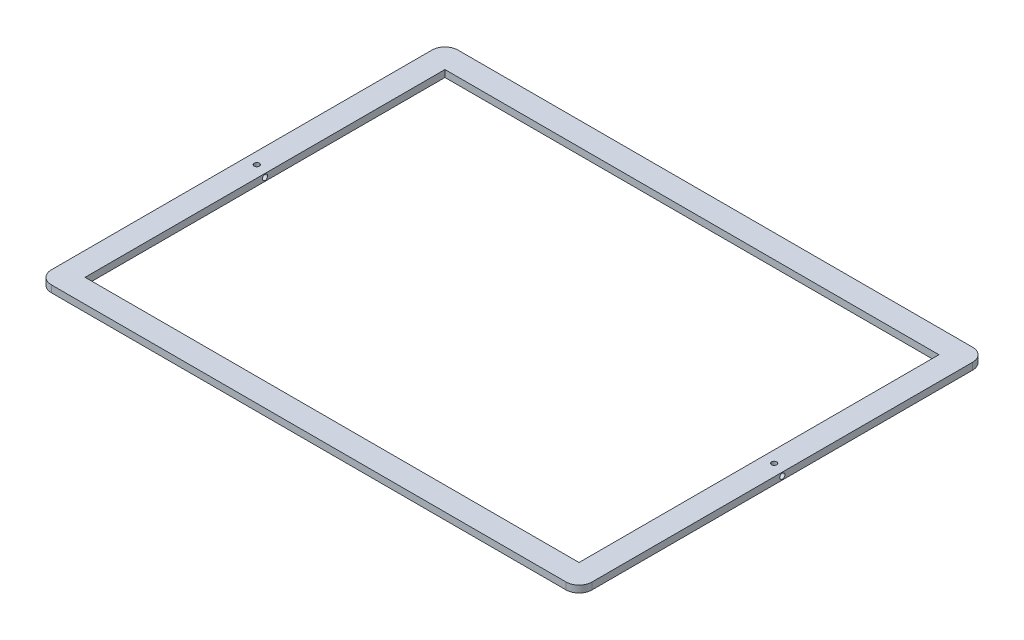
ISO-10303-21;
HEADER;
FILE_DESCRIPTION(('STEP AP214'),'2;1');
FILE_NAME('part.step','',(''),(''),'','','');
FILE_SCHEMA(('AUTOMOTIVE_DESIGN { 1 0 10303 214 1 1 1 1 }'));
ENDSEC;
DATA;
#1=APPLICATION_CONTEXT('core data for automotive mechanical design processes');
#2=APPLICATION_PROTOCOL_DEFINITION('international standard','automotive_design',2000,#1);
#3=PRODUCT_CONTEXT('',#1,'mechanical');
#4=PRODUCT('Part','Part','',(#3));
#5=PRODUCT_RELATED_PRODUCT_CATEGORY('part','',(#4));
#6=PRODUCT_DEFINITION_FORMATION('','',#4);
#7=PRODUCT_DEFINITION_CONTEXT('part definition',#1,'design');
#8=PRODUCT_DEFINITION('design','',#6,#7);
#9=PRODUCT_DEFINITION_SHAPE('','',#8);
#10=(LENGTH_UNIT() NAMED_UNIT(*) SI_UNIT(.MILLI.,.METRE.));
#11=(NAMED_UNIT(*) PLANE_ANGLE_UNIT() SI_UNIT($,.RADIAN.));
#12=(NAMED_UNIT(*) SI_UNIT($,.STERADIAN.) SOLID_ANGLE_UNIT());
#13=UNCERTAINTY_MEASURE_WITH_UNIT(LENGTH_MEASURE(1.E-05),#10,'distance_accuracy_value','');
#14=(GEOMETRIC_REPRESENTATION_CONTEXT(3) GLOBAL_UNCERTAINTY_ASSIGNED_CONTEXT((#13)) GLOBAL_UNIT_ASSIGNED_CONTEXT((#10,
#11,#12)) REPRESENTATION_CONTEXT('',''));
#15=CARTESIAN_POINT('',(0.,0.,0.));
#16=DIRECTION('',(0.,0.,1.));
#17=DIRECTION('',(1.,0.,0.));
#18=AXIS2_PLACEMENT_3D('',#15,#16,#17);
#19=CARTESIAN_POINT('',(0.,4.,0.));
#20=DIRECTION('',(0.,1.,0.));
#21=DIRECTION('',(0.,0.,1.));
#22=AXIS2_PLACEMENT_3D('',#19,#20,#21);
#23=PLANE('',#22);
#24=CARTESIAN_POINT('',(-299.,4.,-4.));
#25=DIRECTION('',(0.,1.,0.));
#26=DIRECTION('',(0.,0.,1.));
#27=AXIS2_PLACEMENT_3D('',#24,#25,#26);
#28=CIRCLE('',#27,2.99999999999999);
#29=CARTESIAN_POINT('',(-299.,4.,-1.00000000000001));
#30=VERTEX_POINT('',#29);
#31=EDGE_CURVE('E459',#30,#30,#28,.T.);
#32=ORIENTED_EDGE('',*,*,#31,.F.);
#33=EDGE_LOOP('',(#32));
#34=FACE_BOUND('',#33,.T.);
#35=CARTESIAN_POINT('',(299.,4.,-4.));
#36=DIRECTION('',(0.,1.,0.));
#37=DIRECTION('',(0.,0.,1.));
#38=AXIS2_PLACEMENT_3D('',#35,#36,#37);
#39=CIRCLE('',#38,2.99999999999999);
#40=CARTESIAN_POINT('',(299.,4.,-1.00000000000001));
#41=VERTEX_POINT('',#40);
#42=EDGE_CURVE('E343',#41,#41,#39,.T.);
#43=ORIENTED_EDGE('',*,*,#42,.F.);
#44=EDGE_LOOP('',(#43));
#45=FACE_BOUND('',#44,.T.);
#46=DIRECTION('',(1.,0.,0.));
#47=VECTOR('',#46,1.);
#48=CARTESIAN_POINT('',(-312.5,4.,235.));
#49=LINE('',#48,#47);
#50=CARTESIAN_POINT('',(-297.5,4.,235.));
#51=VERTEX_POINT('',#50);
#52=CARTESIAN_POINT('',(297.5,4.,235.));
#53=VERTEX_POINT('',#52);
#54=EDGE_CURVE('E179',#51,#53,#49,.T.);
#55=ORIENTED_EDGE('',*,*,#54,.T.);
#56=CARTESIAN_POINT('',(297.5,4.,220.));
#57=DIRECTION('',(0.,1.,0.));
#58=DIRECTION('',(0.,0.,1.));
#59=AXIS2_PLACEMENT_3D('',#56,#57,#58);
#60=CIRCLE('',#59,15.);
#61=CARTESIAN_POINT('',(312.5,4.,220.));
#62=VERTEX_POINT('',#61);
#63=EDGE_CURVE('E219',#53,#62,#60,.T.);
#64=ORIENTED_EDGE('',*,*,#63,.T.);
#65=DIRECTION('',(0.,0.,-1.));
#66=VECTOR('',#65,1.);
#67=CARTESIAN_POINT('',(312.5,4.,-235.));
#68=LINE('',#67,#66);
#69=CARTESIAN_POINT('',(312.5,4.,-220.));
#70=VERTEX_POINT('',#69);
#71=EDGE_CURVE('E183',#62,#70,#68,.T.);
#72=ORIENTED_EDGE('',*,*,#71,.T.);
#73=CARTESIAN_POINT('',(297.5,4.,-220.));
#74=DIRECTION('',(0.,1.,0.));
#75=DIRECTION('',(0.,0.,1.));
#76=AXIS2_PLACEMENT_3D('',#73,#74,#75);
#77=CIRCLE('',#76,15.);
#78=CARTESIAN_POINT('',(297.5,4.,-235.));
#79=VERTEX_POINT('',#78);
#80=EDGE_CURVE('E63',#70,#79,#77,.T.);
#81=ORIENTED_EDGE('',*,*,#80,.T.);
#82=DIRECTION('',(-1.,0.,0.));
#83=VECTOR('',#82,1.);
#84=CARTESIAN_POINT('',(-312.5,4.,-235.));
#85=LINE('',#84,#83);
#86=CARTESIAN_POINT('',(-297.5,4.,-235.));
#87=VERTEX_POINT('',#86);
#88=EDGE_CURVE('E185',#79,#87,#85,.T.);
#89=ORIENTED_EDGE('',*,*,#88,.T.);
#90=CARTESIAN_POINT('',(-297.5,4.,-220.));
#91=DIRECTION('',(0.,1.,0.));
#92=DIRECTION('',(0.,0.,1.));
#93=AXIS2_PLACEMENT_3D('',#90,#91,#92);
#94=CIRCLE('',#93,15.);
#95=CARTESIAN_POINT('',(-312.5,4.,-220.));
#96=VERTEX_POINT('',#95);
#97=EDGE_CURVE('E214',#87,#96,#94,.T.);
#98=ORIENTED_EDGE('',*,*,#97,.T.);
#99=DIRECTION('',(0.,0.,1.));
#100=VECTOR('',#99,1.);
#101=CARTESIAN_POINT('',(-312.5,4.,-235.));
#102=LINE('',#101,#100);
#103=CARTESIAN_POINT('',(-312.5,4.,220.));
#104=VERTEX_POINT('',#103);
#105=EDGE_CURVE('E176',#96,#104,#102,.T.);
#106=ORIENTED_EDGE('',*,*,#105,.T.);
#107=CARTESIAN_POINT('',(-297.5,4.,220.));
#108=DIRECTION('',(0.,1.,0.));
#109=DIRECTION('',(0.,0.,1.));
#110=AXIS2_PLACEMENT_3D('',#107,#108,#109);
#111=CIRCLE('',#110,15.);
#112=EDGE_CURVE('E217',#104,#51,#111,.T.);
#113=ORIENTED_EDGE('',*,*,#112,.T.);
#114=EDGE_LOOP('',(#55,#64,#72,#81,#89,#98,#106,#113));
#115=FACE_BOUND('',#114,.T.);
#116=DIRECTION('',(1.,0.,0.));
#117=VECTOR('',#116,1.);
#118=CARTESIAN_POINT('',(-285.5,4.,208.));
#119=LINE('',#118,#117);
#120=CARTESIAN_POINT('',(-285.5,4.,208.));
#121=VERTEX_POINT('',#120);
#122=CARTESIAN_POINT('',(285.5,4.,208.));
#123=VERTEX_POINT('',#122);
#124=EDGE_CURVE('E143',#121,#123,#119,.T.);
#125=ORIENTED_EDGE('',*,*,#124,.F.);
#126=DIRECTION('',(0.,0.,1.));
#127=VECTOR('',#126,1.);
#128=CARTESIAN_POINT('',(-285.5,4.,-208.));
#129=LINE('',#128,#127);
#130=CARTESIAN_POINT('',(-285.5,4.,-208.));
#131=VERTEX_POINT('',#130);
#132=EDGE_CURVE('E133',#131,#121,#129,.T.);
#133=ORIENTED_EDGE('',*,*,#132,.F.);
#134=DIRECTION('',(-1.,0.,0.));
#135=VECTOR('',#134,1.);
#136=CARTESIAN_POINT('',(-285.5,4.,-208.));
#137=LINE('',#136,#135);
#138=CARTESIAN_POINT('',(285.5,4.,-208.));
#139=VERTEX_POINT('',#138);
#140=EDGE_CURVE('E158',#139,#131,#137,.T.);
#141=ORIENTED_EDGE('',*,*,#140,.F.);
#142=DIRECTION('',(0.,0.,-1.));
#143=VECTOR('',#142,1.);
#144=CARTESIAN_POINT('',(285.5,4.,-208.));
#145=LINE('',#144,#143);
#146=EDGE_CURVE('E156',#123,#139,#145,.T.);
#147=ORIENTED_EDGE('',*,*,#146,.F.);
#148=EDGE_LOOP('',(#125,#133,#141,#147));
#149=FACE_BOUND('',#148,.T.);
#150=ADVANCED_FACE('F35',(#34,#45,#115,#149),#23,.T.);
#151=CARTESIAN_POINT('',(0.,-4.,0.));
#152=DIRECTION('',(0.,1.,0.));
#153=DIRECTION('',(0.,0.,1.));
#154=AXIS2_PLACEMENT_3D('',#151,#152,#153);
#155=PLANE('',#154);
#156=CARTESIAN_POINT('',(-299.,-4.,-4.));
#157=DIRECTION('',(0.,1.,0.));
#158=DIRECTION('',(0.,0.,1.));
#159=AXIS2_PLACEMENT_3D('',#156,#157,#158);
#160=CIRCLE('',#159,2.99999999999999);
#161=CARTESIAN_POINT('',(-299.,-4.,-1.00000000000001));
#162=VERTEX_POINT('',#161);
#163=EDGE_CURVE('E236',#162,#162,#160,.T.);
#164=ORIENTED_EDGE('',*,*,#163,.T.);
#165=EDGE_LOOP('',(#164));
#166=FACE_BOUND('',#165,.T.);
#167=CARTESIAN_POINT('',(299.,-4.,-4.));
#168=DIRECTION('',(0.,1.,0.));
#169=DIRECTION('',(0.,0.,1.));
#170=AXIS2_PLACEMENT_3D('',#167,#168,#169);
#171=CIRCLE('',#170,2.99999999999999);
#172=CARTESIAN_POINT('',(299.,-4.,-1.00000000000001));
#173=VERTEX_POINT('',#172);
#174=EDGE_CURVE('E456',#173,#173,#171,.T.);
#175=ORIENTED_EDGE('',*,*,#174,.T.);
#176=EDGE_LOOP('',(#175));
#177=FACE_BOUND('',#176,.T.);
#178=DIRECTION('',(0.,0.,-1.));
#179=VECTOR('',#178,1.);
#180=CARTESIAN_POINT('',(312.5,-4.,-235.));
#181=LINE('',#180,#179);
#182=CARTESIAN_POINT('',(312.5,-4.,220.));
#183=VERTEX_POINT('',#182);
#184=CARTESIAN_POINT('',(312.5,-4.,-220.));
#185=VERTEX_POINT('',#184);
#186=EDGE_CURVE('E193',#183,#185,#181,.T.);
#187=ORIENTED_EDGE('',*,*,#186,.F.);
#188=CARTESIAN_POINT('',(297.5,-4.,220.));
#189=DIRECTION('',(0.,1.,0.));
#190=DIRECTION('',(0.,0.,1.));
#191=AXIS2_PLACEMENT_3D('',#188,#189,#190);
#192=CIRCLE('',#191,15.);
#193=CARTESIAN_POINT('',(297.5,-4.,235.));
#194=VERTEX_POINT('',#193);
#195=EDGE_CURVE('E207',#183,#194,#192,.F.);
#196=ORIENTED_EDGE('',*,*,#195,.T.);
#197=DIRECTION('',(1.,0.,0.));
#198=VECTOR('',#197,1.);
#199=CARTESIAN_POINT('',(-312.5,-4.,235.));
#200=LINE('',#199,#198);
#201=CARTESIAN_POINT('',(-297.5,-4.,235.));
#202=VERTEX_POINT('',#201);
#203=EDGE_CURVE('E190',#202,#194,#200,.T.);
#204=ORIENTED_EDGE('',*,*,#203,.F.);
#205=CARTESIAN_POINT('',(-297.5,-4.,220.));
#206=DIRECTION('',(0.,1.,0.));
#207=DIRECTION('',(0.,0.,1.));
#208=AXIS2_PLACEMENT_3D('',#205,#206,#207);
#209=CIRCLE('',#208,15.);
#210=CARTESIAN_POINT('',(-312.5,-4.,220.));
#211=VERTEX_POINT('',#210);
#212=EDGE_CURVE('E205',#202,#211,#209,.F.);
#213=ORIENTED_EDGE('',*,*,#212,.T.);
#214=DIRECTION('',(0.,0.,1.));
#215=VECTOR('',#214,1.);
#216=CARTESIAN_POINT('',(-312.5,-4.,-235.));
#217=LINE('',#216,#215);
#218=CARTESIAN_POINT('',(-312.5,-4.,-220.));
#219=VERTEX_POINT('',#218);
#220=EDGE_CURVE('E151',#219,#211,#217,.T.);
#221=ORIENTED_EDGE('',*,*,#220,.F.);
#222=CARTESIAN_POINT('',(-297.5,-4.,-220.));
#223=DIRECTION('',(0.,1.,0.));
#224=DIRECTION('',(0.,0.,1.));
#225=AXIS2_PLACEMENT_3D('',#222,#223,#224);
#226=CIRCLE('',#225,15.);
#227=CARTESIAN_POINT('',(-297.5,-4.,-235.));
#228=VERTEX_POINT('',#227);
#229=EDGE_CURVE('E201',#219,#228,#226,.F.);
#230=ORIENTED_EDGE('',*,*,#229,.T.);
#231=DIRECTION('',(-1.,0.,0.));
#232=VECTOR('',#231,1.);
#233=CARTESIAN_POINT('',(-312.5,-4.,-235.));
#234=LINE('',#233,#232);
#235=CARTESIAN_POINT('',(297.5,-4.,-235.));
#236=VERTEX_POINT('',#235);
#237=EDGE_CURVE('E180',#236,#228,#234,.T.);
#238=ORIENTED_EDGE('',*,*,#237,.F.);
#239=CARTESIAN_POINT('',(297.5,-4.,-220.));
#240=DIRECTION('',(0.,1.,0.));
#241=DIRECTION('',(0.,0.,1.));
#242=AXIS2_PLACEMENT_3D('',#239,#240,#241);
#243=CIRCLE('',#242,15.);
#244=EDGE_CURVE('E203',#236,#185,#243,.F.);
#245=ORIENTED_EDGE('',*,*,#244,.T.);
#246=EDGE_LOOP('',(#187,#196,#204,#213,#221,#230,#238,#245));
#247=FACE_BOUND('',#246,.T.);
#248=DIRECTION('',(0.,0.,1.));
#249=VECTOR('',#248,1.);
#250=CARTESIAN_POINT('',(-285.5,-4.,-208.));
#251=LINE('',#250,#249);
#252=CARTESIAN_POINT('',(-285.5,-4.,-208.));
#253=VERTEX_POINT('',#252);
#254=CARTESIAN_POINT('',(-285.5,-4.,208.));
#255=VERTEX_POINT('',#254);
#256=EDGE_CURVE('E163',#253,#255,#251,.T.);
#257=ORIENTED_EDGE('',*,*,#256,.T.);
#258=DIRECTION('',(1.,0.,0.));
#259=VECTOR('',#258,1.);
#260=CARTESIAN_POINT('',(-285.5,-4.,208.));
#261=LINE('',#260,#259);
#262=CARTESIAN_POINT('',(285.5,-4.,208.));
#263=VERTEX_POINT('',#262);
#264=EDGE_CURVE('E150',#255,#263,#261,.T.);
#265=ORIENTED_EDGE('',*,*,#264,.T.);
#266=DIRECTION('',(0.,0.,-1.));
#267=VECTOR('',#266,1.);
#268=CARTESIAN_POINT('',(285.5,-4.,-208.));
#269=LINE('',#268,#267);
#270=CARTESIAN_POINT('',(285.5,-4.,-208.));
#271=VERTEX_POINT('',#270);
#272=EDGE_CURVE('E167',#263,#271,#269,.T.);
#273=ORIENTED_EDGE('',*,*,#272,.T.);
#274=DIRECTION('',(-1.,0.,0.));
#275=VECTOR('',#274,1.);
#276=CARTESIAN_POINT('',(-285.5,-4.,-208.));
#277=LINE('',#276,#275);
#278=EDGE_CURVE('E144',#271,#253,#277,.T.);
#279=ORIENTED_EDGE('',*,*,#278,.T.);
#280=EDGE_LOOP('',(#257,#265,#273,#279));
#281=FACE_BOUND('',#280,.T.);
#282=ADVANCED_FACE('F254',(#166,#177,#247,#281),#155,.F.);
#283=CARTESIAN_POINT('',(-312.5,4.,-235.));
#284=DIRECTION('',(1.,0.,0.));
#285=DIRECTION('',(0.,0.,-1.));
#286=AXIS2_PLACEMENT_3D('',#283,#284,#285);
#287=PLANE('',#286);
#288=CARTESIAN_POINT('',(-312.5,0.,0.));
#289=DIRECTION('',(1.,0.,0.));
#290=DIRECTION('',(0.,0.,-1.));
#291=AXIS2_PLACEMENT_3D('',#288,#289,#290);
#292=CIRCLE('',#291,3.);
#293=CARTESIAN_POINT('',(-312.5,0.,-3.));
#294=VERTEX_POINT('',#293);
#295=EDGE_CURVE('E229',#294,#294,#292,.T.);
#296=ORIENTED_EDGE('',*,*,#295,.T.);
#297=EDGE_LOOP('',(#296));
#298=FACE_BOUND('',#297,.T.);
#299=ORIENTED_EDGE('',*,*,#220,.T.);
#300=DIRECTION('',(0.,-1.,0.));
#301=VECTOR('',#300,1.);
#302=CARTESIAN_POINT('',(-312.5,4.,220.));
#303=LINE('',#302,#301);
#304=EDGE_CURVE('E224',#211,#104,#303,.F.);
#305=ORIENTED_EDGE('',*,*,#304,.T.);
#306=ORIENTED_EDGE('',*,*,#105,.F.);
#307=DIRECTION('',(0.,-1.,0.));
#308=VECTOR('',#307,1.);
#309=CARTESIAN_POINT('',(-312.5,4.,-220.));
#310=LINE('',#309,#308);
#311=EDGE_CURVE('E221',#96,#219,#310,.T.);
#312=ORIENTED_EDGE('',*,*,#311,.T.);
#313=EDGE_LOOP('',(#299,#305,#306,#312));
#314=FACE_BOUND('',#313,.T.);
#315=ADVANCED_FACE('F260',(#298,#314),#287,.F.);
#316=CARTESIAN_POINT('',(-312.5,4.,235.));
#317=DIRECTION('',(0.,0.,-1.));
#318=DIRECTION('',(-1.,0.,0.));
#319=AXIS2_PLACEMENT_3D('',#316,#317,#318);
#320=PLANE('',#319);
#321=ORIENTED_EDGE('',*,*,#203,.T.);
#322=DIRECTION('',(0.,-1.,0.));
#323=VECTOR('',#322,1.);
#324=CARTESIAN_POINT('',(297.5,4.,235.));
#325=LINE('',#324,#323);
#326=EDGE_CURVE('E212',#194,#53,#325,.F.);
#327=ORIENTED_EDGE('',*,*,#326,.T.);
#328=ORIENTED_EDGE('',*,*,#54,.F.);
#329=DIRECTION('',(0.,-1.,0.));
#330=VECTOR('',#329,1.);
#331=CARTESIAN_POINT('',(-297.5,4.,235.));
#332=LINE('',#331,#330);
#333=EDGE_CURVE('E209',#51,#202,#332,.T.);
#334=ORIENTED_EDGE('',*,*,#333,.T.);
#335=EDGE_LOOP('',(#321,#327,#328,#334));
#336=FACE_BOUND('',#335,.T.);
#337=ADVANCED_FACE('F274',(#336),#320,.F.);
#338=CARTESIAN_POINT('',(312.5,4.,-235.));
#339=DIRECTION('',(-1.,0.,0.));
#340=DIRECTION('',(0.,0.,1.));
#341=AXIS2_PLACEMENT_3D('',#338,#339,#340);
#342=PLANE('',#341);
#343=CARTESIAN_POINT('',(312.5,0.,0.));
#344=DIRECTION('',(1.,0.,0.));
#345=DIRECTION('',(0.,0.,-1.));
#346=AXIS2_PLACEMENT_3D('',#343,#344,#345);
#347=CIRCLE('',#346,3.);
#348=CARTESIAN_POINT('',(312.5,0.,-3.));
#349=VERTEX_POINT('',#348);
#350=EDGE_CURVE('E337',#349,#349,#347,.T.);
#351=ORIENTED_EDGE('',*,*,#350,.F.);
#352=EDGE_LOOP('',(#351));
#353=FACE_BOUND('',#352,.T.);
#354=ORIENTED_EDGE('',*,*,#71,.F.);
#355=DIRECTION('',(0.,-1.,0.));
#356=VECTOR('',#355,1.);
#357=CARTESIAN_POINT('',(312.5,4.,220.));
#358=LINE('',#357,#356);
#359=EDGE_CURVE('E198',#62,#183,#358,.T.);
#360=ORIENTED_EDGE('',*,*,#359,.T.);
#361=ORIENTED_EDGE('',*,*,#186,.T.);
#362=DIRECTION('',(0.,-1.,0.));
#363=VECTOR('',#362,1.);
#364=CARTESIAN_POINT('',(312.5,4.,-220.));
#365=LINE('',#364,#363);
#366=EDGE_CURVE('E187',#185,#70,#365,.F.);
#367=ORIENTED_EDGE('',*,*,#366,.T.);
#368=EDGE_LOOP('',(#354,#360,#361,#367));
#369=FACE_BOUND('',#368,.T.);
#370=ADVANCED_FACE('F271',(#353,#369),#342,.F.);
#371=CARTESIAN_POINT('',(-312.5,4.,-235.));
#372=DIRECTION('',(0.,0.,1.));
#373=DIRECTION('',(1.,0.,0.));
#374=AXIS2_PLACEMENT_3D('',#371,#372,#373);
#375=PLANE('',#374);
#376=ORIENTED_EDGE('',*,*,#88,.F.);
#377=DIRECTION('',(0.,-1.,0.));
#378=VECTOR('',#377,1.);
#379=CARTESIAN_POINT('',(297.5,4.,-235.));
#380=LINE('',#379,#378);
#381=EDGE_CURVE('E11',#79,#236,#380,.T.);
#382=ORIENTED_EDGE('',*,*,#381,.T.);
#383=ORIENTED_EDGE('',*,*,#237,.T.);
#384=DIRECTION('',(0.,-1.,0.));
#385=VECTOR('',#384,1.);
#386=CARTESIAN_POINT('',(-297.5,4.,-235.));
#387=LINE('',#386,#385);
#388=EDGE_CURVE('E49',#228,#87,#387,.F.);
#389=ORIENTED_EDGE('',*,*,#388,.T.);
#390=EDGE_LOOP('',(#376,#382,#383,#389));
#391=FACE_BOUND('',#390,.T.);
#392=ADVANCED_FACE('F268',(#391),#375,.F.);
#393=CARTESIAN_POINT('',(-285.5,4.,-208.));
#394=DIRECTION('',(1.,0.,0.));
#395=DIRECTION('',(0.,0.,-1.));
#396=AXIS2_PLACEMENT_3D('',#393,#394,#395);
#397=PLANE('',#396);
#398=CARTESIAN_POINT('',(-285.5,0.,0.));
#399=DIRECTION('',(1.,0.,0.));
#400=DIRECTION('',(0.,0.,-1.));
#401=AXIS2_PLACEMENT_3D('',#398,#399,#400);
#402=CIRCLE('',#401,3.);
#403=CARTESIAN_POINT('',(-285.5,0.,-3.));
#404=VERTEX_POINT('',#403);
#405=EDGE_CURVE('E165',#404,#404,#402,.T.);
#406=ORIENTED_EDGE('',*,*,#405,.F.);
#407=EDGE_LOOP('',(#406));
#408=FACE_BOUND('',#407,.T.);
#409=ORIENTED_EDGE('',*,*,#256,.F.);
#410=DIRECTION('',(0.,-1.,0.));
#411=VECTOR('',#410,1.);
#412=CARTESIAN_POINT('',(-285.5,4.,-208.));
#413=LINE('',#412,#411);
#414=EDGE_CURVE('E139',#131,#253,#413,.T.);
#415=ORIENTED_EDGE('',*,*,#414,.F.);
#416=ORIENTED_EDGE('',*,*,#132,.T.);
#417=DIRECTION('',(0.,-1.,0.));
#418=VECTOR('',#417,1.);
#419=CARTESIAN_POINT('',(-285.5,4.,208.));
#420=LINE('',#419,#418);
#421=EDGE_CURVE('E136',#121,#255,#420,.T.);
#422=ORIENTED_EDGE('',*,*,#421,.T.);
#423=EDGE_LOOP('',(#409,#415,#416,#422));
#424=FACE_BOUND('',#423,.T.);
#425=ADVANCED_FACE('F135',(#408,#424),#397,.T.);
#426=CARTESIAN_POINT('',(-285.5,4.,208.));
#427=DIRECTION('',(0.,0.,-1.));
#428=DIRECTION('',(-1.,0.,0.));
#429=AXIS2_PLACEMENT_3D('',#426,#427,#428);
#430=PLANE('',#429);
#431=ORIENTED_EDGE('',*,*,#264,.F.);
#432=ORIENTED_EDGE('',*,*,#421,.F.);
#433=ORIENTED_EDGE('',*,*,#124,.T.);
#434=DIRECTION('',(0.,-1.,0.));
#435=VECTOR('',#434,1.);
#436=CARTESIAN_POINT('',(285.5,4.,208.));
#437=LINE('',#436,#435);
#438=EDGE_CURVE('E152',#123,#263,#437,.T.);
#439=ORIENTED_EDGE('',*,*,#438,.T.);
#440=EDGE_LOOP('',(#431,#432,#433,#439));
#441=FACE_BOUND('',#440,.T.);
#442=ADVANCED_FACE('F147',(#441),#430,.T.);
#443=CARTESIAN_POINT('',(285.5,4.,-208.));
#444=DIRECTION('',(-1.,0.,0.));
#445=DIRECTION('',(0.,0.,1.));
#446=AXIS2_PLACEMENT_3D('',#443,#444,#445);
#447=PLANE('',#446);
#448=CARTESIAN_POINT('',(285.5,0.,0.));
#449=DIRECTION('',(-1.,0.,0.));
#450=DIRECTION('',(0.,0.,1.));
#451=AXIS2_PLACEMENT_3D('',#448,#449,#450);
#452=CIRCLE('',#451,3.);
#453=CARTESIAN_POINT('',(285.5,0.,3.));
#454=VERTEX_POINT('',#453);
#455=EDGE_CURVE('E227',#454,#454,#452,.T.);
#456=ORIENTED_EDGE('',*,*,#455,.F.);
#457=EDGE_LOOP('',(#456));
#458=FACE_BOUND('',#457,.T.);
#459=ORIENTED_EDGE('',*,*,#272,.F.);
#460=ORIENTED_EDGE('',*,*,#438,.F.);
#461=ORIENTED_EDGE('',*,*,#146,.T.);
#462=DIRECTION('',(0.,-1.,0.));
#463=VECTOR('',#462,1.);
#464=CARTESIAN_POINT('',(285.5,4.,-208.));
#465=LINE('',#464,#463);
#466=EDGE_CURVE('E173',#139,#271,#465,.T.);
#467=ORIENTED_EDGE('',*,*,#466,.T.);
#468=EDGE_LOOP('',(#459,#460,#461,#467));
#469=FACE_BOUND('',#468,.T.);
#470=ADVANCED_FACE('F322',(#458,#469),#447,.T.);
#471=CARTESIAN_POINT('',(-285.5,4.,-208.));
#472=DIRECTION('',(0.,0.,1.));
#473=DIRECTION('',(1.,0.,0.));
#474=AXIS2_PLACEMENT_3D('',#471,#472,#473);
#475=PLANE('',#474);
#476=ORIENTED_EDGE('',*,*,#278,.F.);
#477=ORIENTED_EDGE('',*,*,#466,.F.);
#478=ORIENTED_EDGE('',*,*,#140,.T.);
#479=ORIENTED_EDGE('',*,*,#414,.T.);
#480=EDGE_LOOP('',(#476,#477,#478,#479));
#481=FACE_BOUND('',#480,.T.);
#482=ADVANCED_FACE('F286',(#481),#475,.T.);
#483=CARTESIAN_POINT('',(297.5,4.,220.));
#484=DIRECTION('',(0.,-1.,0.));
#485=DIRECTION('',(0.,0.,-1.));
#486=AXIS2_PLACEMENT_3D('',#483,#484,#485);
#487=CYLINDRICAL_SURFACE('',#486,15.);
#488=ORIENTED_EDGE('',*,*,#63,.F.);
#489=ORIENTED_EDGE('',*,*,#326,.F.);
#490=ORIENTED_EDGE('',*,*,#195,.F.);
#491=ORIENTED_EDGE('',*,*,#359,.F.);
#492=EDGE_LOOP('',(#488,#489,#490,#491));
#493=FACE_BOUND('',#492,.T.);
#494=ADVANCED_FACE('F282',(#493),#487,.T.);
#495=CARTESIAN_POINT('',(-297.5,4.,220.));
#496=DIRECTION('',(0.,-1.,0.));
#497=DIRECTION('',(0.,0.,-1.));
#498=AXIS2_PLACEMENT_3D('',#495,#496,#497);
#499=CYLINDRICAL_SURFACE('',#498,15.);
#500=ORIENTED_EDGE('',*,*,#112,.F.);
#501=ORIENTED_EDGE('',*,*,#304,.F.);
#502=ORIENTED_EDGE('',*,*,#212,.F.);
#503=ORIENTED_EDGE('',*,*,#333,.F.);
#504=EDGE_LOOP('',(#500,#501,#502,#503));
#505=FACE_BOUND('',#504,.T.);
#506=ADVANCED_FACE('F285',(#505),#499,.T.);
#507=CARTESIAN_POINT('',(297.5,4.,-220.));
#508=DIRECTION('',(0.,-1.,0.));
#509=DIRECTION('',(0.,0.,-1.));
#510=AXIS2_PLACEMENT_3D('',#507,#508,#509);
#511=CYLINDRICAL_SURFACE('',#510,15.);
#512=ORIENTED_EDGE('',*,*,#80,.F.);
#513=ORIENTED_EDGE('',*,*,#366,.F.);
#514=ORIENTED_EDGE('',*,*,#244,.F.);
#515=ORIENTED_EDGE('',*,*,#381,.F.);
#516=EDGE_LOOP('',(#512,#513,#514,#515));
#517=FACE_BOUND('',#516,.T.);
#518=ADVANCED_FACE('F289',(#517),#511,.T.);
#519=CARTESIAN_POINT('',(-297.5,4.,-220.));
#520=DIRECTION('',(0.,-1.,0.));
#521=DIRECTION('',(0.,0.,-1.));
#522=AXIS2_PLACEMENT_3D('',#519,#520,#521);
#523=CYLINDRICAL_SURFACE('',#522,15.);
#524=ORIENTED_EDGE('',*,*,#97,.F.);
#525=ORIENTED_EDGE('',*,*,#388,.F.);
#526=ORIENTED_EDGE('',*,*,#229,.F.);
#527=ORIENTED_EDGE('',*,*,#311,.F.);
#528=EDGE_LOOP('',(#524,#525,#526,#527));
#529=FACE_BOUND('',#528,.T.);
#530=ADVANCED_FACE('F37',(#529),#523,.T.);
#531=CARTESIAN_POINT('',(-312.5,0.,0.));
#532=DIRECTION('',(1.,0.,0.));
#533=DIRECTION('',(0.,0.,-1.));
#534=AXIS2_PLACEMENT_3D('',#531,#532,#533);
#535=CYLINDRICAL_SURFACE('',#534,3.);
#536=CARTESIAN_POINT('',(296.171572875254,0.,-3.));
#537=CARTESIAN_POINT('',(296.171567652578,0.153431257140825,-2.99999632375911));
#538=CARTESIAN_POINT('',(296.175667485006,0.307078125600935,-2.98818419258358));
#539=CARTESIAN_POINT('',(296.19293629944,0.61063298358805,-2.94121766614566));
#540=CARTESIAN_POINT('',(296.206128293798,0.760530483514459,-2.90600404960032));
#541=CARTESIAN_POINT('',(296.234591859755,0.979105128271315,-2.83676630994888));
#542=CARTESIAN_POINT('',(296.245548791042,1.05102195999645,-2.81089928780379));
#543=CARTESIAN_POINT('',(296.270812994316,1.19216501585701,-2.75400072927466));
#544=CARTESIAN_POINT('',(296.28511895307,1.26139228226153,-2.72297121860336));
#545=CARTESIAN_POINT('',(296.317543725631,1.39652608990879,-2.65619878577817));
#546=CARTESIAN_POINT('',(296.3356591269,1.46243553823229,-2.62046009278909));
#547=CARTESIAN_POINT('',(296.376210520496,1.59042463209472,-2.54481287007393));
#548=CARTESIAN_POINT('',(296.398646142262,1.65250460549917,-2.50490469811355));
#549=CARTESIAN_POINT('',(296.447043199543,1.76922855601669,-2.42376204931032));
#550=CARTESIAN_POINT('',(296.472766527195,1.82409028683028,-2.38269895605555));
#551=CARTESIAN_POINT('',(296.528865147766,1.92944392039224,-2.29821772294534));
#552=CARTESIAN_POINT('',(296.559239913782,1.97993631707565,-2.25479985019301));
#553=CARTESIAN_POINT('',(296.624865447061,2.07619321642427,-2.1664910485079));
#554=CARTESIAN_POINT('',(296.660113376206,2.12196044411062,-2.12160098849745));
#555=CARTESIAN_POINT('',(296.735571318843,2.20857438108782,-2.03128573369538));
#556=CARTESIAN_POINT('',(296.775780922446,2.24942149628434,-1.98586058338821));
#557=CARTESIAN_POINT('',(296.895289791471,2.3567728593549,-1.85928968415093));
#558=CARTESIAN_POINT('',(296.980169891042,2.41772873683536,-1.77857619350489));
#559=CARTESIAN_POINT('',(297.164486068185,2.52418259663754,-1.62399818537289));
#560=CARTESIAN_POINT('',(297.263925984666,2.56967649164266,-1.55013548261288));
#561=CARTESIAN_POINT('',(297.475518709941,2.64751701931571,-1.41312155256432));
#562=CARTESIAN_POINT('',(297.587744932809,2.67978227823691,-1.35003797528031));
#563=CARTESIAN_POINT('',(297.821517045586,2.73329989428716,-1.23811608040492));
#564=CARTESIAN_POINT('',(297.943066415698,2.75454811571541,-1.18928311537328));
#565=CARTESIAN_POINT('',(298.205156376877,2.79005961920202,-1.10360779914686));
#566=CARTESIAN_POINT('',(298.346377524791,2.80340551361811,-1.06846525815459));
#567=CARTESIAN_POINT('',(298.632963754487,2.82176607703933,-1.01898404058636));
#568=CARTESIAN_POINT('',(298.778330544789,2.82677725912297,-1.00465407150374));
#569=CARTESIAN_POINT('',(299.080678632946,2.82949475400979,-0.996992599305701));
#570=CARTESIAN_POINT('',(299.237708747257,2.8266214120579,-1.00532693544086));
#571=CARTESIAN_POINT('',(299.548259913054,2.81168687524604,-1.0463747165422));
#572=CARTESIAN_POINT('',(299.701779817612,2.79962272033986,-1.07909601564058));
#573=CARTESIAN_POINT('',(299.926372428838,2.77278150720319,-1.14552420638036));
#574=CARTESIAN_POINT('',(300.000594656994,2.76231296373177,-1.17070380900172));
#575=CARTESIAN_POINT('',(300.146353126198,2.73796976876269,-1.2265633552978));
#576=CARTESIAN_POINT('',(300.217890517315,2.72409659531286,-1.2572409105984));
#577=CARTESIAN_POINT('',(300.357639604928,2.69244797545034,-1.32365910988873));
#578=CARTESIAN_POINT('',(300.425852650938,2.67467412891032,-1.35939767596421));
#579=CARTESIAN_POINT('',(300.558364600688,2.63468324325037,-1.43536963031614));
#580=CARTESIAN_POINT('',(300.622663898119,2.61246665199871,-1.47560256533982));
#581=CARTESIAN_POINT('',(300.742511594156,2.5647612504899,-1.55694135627802));
#582=CARTESIAN_POINT('',(300.798357731315,2.53959929041312,-1.59780019252029));
#583=CARTESIAN_POINT('',(300.905689502231,2.48461562432612,-1.682026707664));
#584=CARTESIAN_POINT('',(300.957175686104,2.45479450754016,-1.72539406888652));
#585=CARTESIAN_POINT('',(301.05539850334,2.39025135174361,-1.81374857185005));
#586=CARTESIAN_POINT('',(301.102138757366,2.35553309780728,-1.85873444280115));
#587=CARTESIAN_POINT('',(301.19066488932,2.28108236087676,-1.94938807204978));
#588=CARTESIAN_POINT('',(301.232451188956,2.2413503052799,-1.99505577193316));
#589=CARTESIAN_POINT('',(301.342134187016,2.12330935244398,-2.12223841403082));
#590=CARTESIAN_POINT('',(301.404470345249,2.03938767767275,-2.20347232034704));
#591=CARTESIAN_POINT('',(301.513492325242,1.85675478297761,-2.3594296005758));
#592=CARTESIAN_POINT('',(301.560173876995,1.75803953851254,-2.43415119405968));
#593=CARTESIAN_POINT('',(301.639947622709,1.5481820156243,-2.57273397053417));
#594=CARTESIAN_POINT('',(301.673027694913,1.43702876406796,-2.63658543641027));
#595=CARTESIAN_POINT('',(301.728045262989,1.20523435309344,-2.75029173318743));
#596=CARTESIAN_POINT('',(301.749978661596,1.08458972364985,-2.80014141434239));
#597=CARTESIAN_POINT('',(301.786788433575,0.824361211344793,-2.88809856761014));
#598=CARTESIAN_POINT('',(301.80074719698,0.684086528266734,-2.92454740891307));
#599=CARTESIAN_POINT('',(301.82027526591,0.39916529135598,-2.97685628130519));
#600=CARTESIAN_POINT('',(301.825841043796,0.254516925269463,-2.992707654726));
#601=CARTESIAN_POINT('',(301.829746033862,-0.0469387510431546,-3.00371117619369));
#602=CARTESIAN_POINT('',(301.827490027562,-0.203817384090743,-2.99715897416898));
#603=CARTESIAN_POINT('',(301.813926072354,-0.514394734826825,-2.95970020869835));
#604=CARTESIAN_POINT('',(301.802615092842,-0.668092370198076,-2.92878549142845));
#605=CARTESIAN_POINT('',(301.777083574138,-0.893417435977922,-2.86496452090385));
#606=CARTESIAN_POINT('',(301.767066346212,-0.968051522071322,-2.84059956387706));
#607=CARTESIAN_POINT('',(301.743688966574,-1.11471842275836,-2.78630627934969));
#608=CARTESIAN_POINT('',(301.730330245703,-1.18675233568882,-2.75638033449559));
#609=CARTESIAN_POINT('',(301.699778991655,-1.32758221395268,-2.69138267164992));
#610=CARTESIAN_POINT('',(301.682587845673,-1.39637933999817,-2.65631281712962));
#611=CARTESIAN_POINT('',(301.643831259958,-1.53014133388635,-2.58157575995593));
#612=CARTESIAN_POINT('',(301.622266244373,-1.59510657253047,-2.54190900323733));
#613=CARTESIAN_POINT('',(301.575808791918,-1.71649493416654,-2.4614218368272));
#614=CARTESIAN_POINT('',(301.55122594748,-1.77319884281356,-2.42084627105697));
#615=CARTESIAN_POINT('',(301.497410776651,-1.8822721315402,-2.33704527417295));
#616=CARTESIAN_POINT('',(301.46817904777,-1.93464206734219,-2.29382018403472));
#617=CARTESIAN_POINT('',(301.404804937766,-2.03463707801561,-2.20560456503758));
#618=CARTESIAN_POINT('',(301.370666546959,-2.08226595576268,-2.16061549214078));
#619=CARTESIAN_POINT('',(301.297342817232,-2.17255441002481,-2.06981045026512));
#620=CARTESIAN_POINT('',(301.25815793352,-2.21521443408444,-2.02399455618801));
#621=CARTESIAN_POINT('',(301.141669080792,-2.32718934905915,-1.89631694459901));
#622=CARTESIAN_POINT('',(301.058713487639,-2.39092519121396,-1.81458367272033));
#623=CARTESIAN_POINT('',(300.877782385873,-2.5025550224255,-1.65728202612899));
#624=CARTESIAN_POINT('',(300.779803046451,-2.55044496117233,-1.58171523131845));
#625=CARTESIAN_POINT('',(300.571685391136,-2.63218434664316,-1.44158651556874));
#626=CARTESIAN_POINT('',(300.46159980098,-2.66609184477595,-1.37697976333435));
#627=CARTESIAN_POINT('',(300.231771499313,-2.7226326459253,-1.26151381974243));
#628=CARTESIAN_POINT('',(300.112025281545,-2.7452618339738,-1.21065964919854));
#629=CARTESIAN_POINT('',(299.853666847372,-2.78338274349195,-1.12045893143051));
#630=CARTESIAN_POINT('',(299.714355517369,-2.79795838852149,-1.08272718756637));
#631=CARTESIAN_POINT('',(299.431137080076,-2.81865768842373,-1.02763388213974));
#632=CARTESIAN_POINT('',(299.287228063297,-2.82477778363874,-1.01028090018645));
#633=CARTESIAN_POINT('',(298.986723198779,-2.82986447852548,-0.99596530556129));
#634=CARTESIAN_POINT('',(298.830032685619,-2.82822020996351,-1.00074332927305));
#635=CARTESIAN_POINT('',(298.519505321536,-2.81600684497754,-1.03461928287711));
#636=CARTESIAN_POINT('',(298.36566947908,-2.80543465370176,-1.06372564611814));
#637=CARTESIAN_POINT('',(298.139672882774,-2.78118774926805,-1.12492253122236));
#638=CARTESIAN_POINT('',(298.064646927777,-2.77161425903294,-1.14846262677801));
#639=CARTESIAN_POINT('',(297.917111070402,-2.74918698557769,-1.20116577187116));
#640=CARTESIAN_POINT('',(297.84460012066,-2.73633458694008,-1.23032644674265));
#641=CARTESIAN_POINT('',(297.702727709839,-2.70686489734086,-1.29387231255102));
#642=CARTESIAN_POINT('',(297.633365258279,-2.69024880038667,-1.32825584543508));
#643=CARTESIAN_POINT('',(297.498389122299,-2.65271277052699,-1.40171881617533));
#644=CARTESIAN_POINT('',(297.432775089779,-2.63179323809588,-1.44079781693427));
#645=CARTESIAN_POINT('',(297.309871617352,-2.58657827095974,-1.52038569050874));
#646=CARTESIAN_POINT('',(297.252318202463,-2.56257520447122,-1.56065290504059));
#647=CARTESIAN_POINT('',(297.141516432407,-2.50993356139863,-1.64397731153259));
#648=CARTESIAN_POINT('',(297.088267517874,-2.48129558857299,-1.68703413967084));
#649=CARTESIAN_POINT('',(296.986504603358,-2.41910250912885,-1.77506038459687));
#650=CARTESIAN_POINT('',(296.937986745536,-2.38555146558135,-1.8200281994101));
#651=CARTESIAN_POINT('',(296.845931413332,-2.31337341059946,-1.9109374943364));
#652=CARTESIAN_POINT('',(296.802393466483,-2.27474688144983,-1.95687888159084));
#653=CARTESIAN_POINT('',(296.688091785207,-2.15982082330223,-2.08501647946778));
#654=CARTESIAN_POINT('',(296.622926335378,-2.0778297385658,-2.16723910831442));
#655=CARTESIAN_POINT('',(296.508637575009,-1.89860458175469,-2.32586339445511));
#656=CARTESIAN_POINT('',(296.459516120872,-1.8013687476803,-2.40226437736017));
#657=CARTESIAN_POINT('',(296.375787562208,-1.59502046767558,-2.54389995505745));
#658=CARTESIAN_POINT('',(296.34104715958,-1.48602946846935,-2.60923362446191));
#659=CARTESIAN_POINT('',(296.282952538715,-1.25815683698428,-2.7264426744529));
#660=CARTESIAN_POINT('',(296.259608624012,-1.13926636785448,-2.77830585665957));
#661=CARTESIAN_POINT('',(296.220135395452,-0.882612625607325,-2.87077965185902));
#662=CARTESIAN_POINT('',(296.204929065293,-0.744138599003528,-2.90980438712212));
#663=CARTESIAN_POINT('',(296.183069208736,-0.46258652732112,-2.96759423711797));
#664=CARTESIAN_POINT('',(296.17639966973,-0.319517619427642,-2.98639727142483));
#665=CARTESIAN_POINT('',(296.172792826268,-0.146659739928375,-2.99655743067836));
#666=CARTESIAN_POINT('',(296.172334554822,-0.117346173752515,-2.9978476941939));
#667=CARTESIAN_POINT('',(296.171725080809,-0.0586910346083558,-2.99956932492978));
#668=CARTESIAN_POINT('',(296.171573874286,-0.0293494620058475,-3.00000070321846));
#669=CARTESIAN_POINT('',(296.171572875254,0.,-3.));
#670=B_SPLINE_CURVE_WITH_KNOTS('',3,(#536,#537,#538,#539,#540,#541,#542,#543,#544,#545,#546,
#547,#548,#549,#550,#551,#552,#553,#554,#555,#556,#557,#558,#559,#560,#561,#562,#563,#564,#565,
#566,#567,#568,#569,#570,#571,#572,#573,#574,#575,#576,#577,#578,#579,#580,#581,#582,#583,#584,
#585,#586,#587,#588,#589,#590,#591,#592,#593,#594,#595,#596,#597,#598,#599,#600,#601,#602,#603,
#604,#605,#606,#607,#608,#609,#610,#611,#612,#613,#614,#615,#616,#617,#618,#619,#620,#621,#622,
#623,#624,#625,#626,#627,#628,#629,#630,#631,#632,#633,#634,#635,#636,#637,#638,#639,#640,#641,
#642,#643,#644,#645,#646,#647,#648,#649,#650,#651,#652,#653,#654,#655,#656,#657,#658,#659,#660,
#661,#662,#663,#664,#665,#666,#667,#668,#669),.UNSPECIFIED.,.T.,.F.,(4,2,2,2,2,2,2,2,2,2,2,2,2,
2,2,2,2,2,2,2,2,2,2,2,2,2,2,2,2,2,2,2,2,2,2,2,2,2,2,2,2,2,2,2,2,2,2,2,2,2,2,2,2,2,2,2,2,2,2,2,2,
2,2,2,2,2,4),(0.,0.460192821426654,0.921554693499794,1.15293582696323,1.38422638182113,
1.61531062003811,1.84637504613567,2.06565771770744,2.28491556781289,2.50404625642913,
2.72315885452335,3.11718511694618,3.51131545785483,3.90783511010519,4.30450350483861,
4.74106487085001,5.17780883136546,5.64750377999833,6.11735006527939,6.35431459623748,
6.59117643549225,6.82794130612065,7.06468232076049,7.28526444834918,7.5058187023768,
7.72620341126447,7.94656934631738,8.34162407263807,8.73678646803297,9.13230027622597,
9.52795936137005,9.96292726667696,10.3980779415872,10.8670458529864,11.3361707886748,
11.5733581308412,11.8104440816726,12.047444355136,12.2844216569691,12.5059105870205,
12.7273710725734,12.9486524651075,13.1699139113933,13.5660385192376,13.96226430088,
14.3568280805818,14.7515357143644,15.184899931651,15.6184465331389,16.0866459408516,
16.5550077158814,16.792393770406,17.0296797495144,17.2668905564474,17.5040792987037,
17.7264573114229,17.9488063797179,18.1709725948074,18.3931177143794,18.7904074910922,
19.1877432207572,19.5813087958453,19.9752295366011,20.4074787462195,20.8389159845959,
20.9269461945951,21.0149752701532),.UNSPECIFIED.);
#671=CARTESIAN_POINT('',(296.171572875254,0.,-3.));
#672=VERTEX_POINT('',#671);
#673=EDGE_CURVE('E39',#672,#672,#670,.T.);
#674=ORIENTED_EDGE('',*,*,#673,.T.);
#675=EDGE_LOOP('',(#674));
#676=FACE_BOUND('',#675,.T.);
#677=ORIENTED_EDGE('',*,*,#455,.T.);
#678=EDGE_LOOP('',(#677));
#679=FACE_BOUND('',#678,.T.);
#680=ORIENTED_EDGE('',*,*,#350,.T.);
#681=EDGE_LOOP('',(#680));
#682=FACE_BOUND('',#681,.T.);
#683=ADVANCED_FACE('F237',(#676,#679,#682),#535,.F.);
#684=CARTESIAN_POINT('',(-301.828427124746,0.,-3.));
#685=CARTESIAN_POINT('',(-301.828432347422,0.153431257140824,-2.99999632375911));
#686=CARTESIAN_POINT('',(-301.824332514993,0.307078125600934,-2.98818419258358));
#687=CARTESIAN_POINT('',(-301.80706370056,0.610632983588048,-2.94121766614566));
#688=CARTESIAN_POINT('',(-301.793871706202,0.760530483514455,-2.90600404960032));
#689=CARTESIAN_POINT('',(-301.765408140245,0.979105128271331,-2.83676630994887));
#690=CARTESIAN_POINT('',(-301.754451208958,1.05102195999648,-2.81089928780378));
#691=CARTESIAN_POINT('',(-301.729187005683,1.19216501585705,-2.75400072927464));
#692=CARTESIAN_POINT('',(-301.71488104693,1.26139228226156,-2.72297121860334));
#693=CARTESIAN_POINT('',(-301.682456274369,1.39652608990883,-2.65619878577815));
#694=CARTESIAN_POINT('',(-301.6643408731,1.46243553823234,-2.62046009278906));
#695=CARTESIAN_POINT('',(-301.623789479504,1.59042463209476,-2.54481287007391));
#696=CARTESIAN_POINT('',(-301.601353857738,1.6525046054992,-2.50490469811353));
#697=CARTESIAN_POINT('',(-301.552956800457,1.7692285560167,-2.42376204931031));
#698=CARTESIAN_POINT('',(-301.527233472805,1.82409028683029,-2.38269895605554));
#699=CARTESIAN_POINT('',(-301.471134852234,1.92944392039224,-2.29821772294533));
#700=CARTESIAN_POINT('',(-301.440760086218,1.97993631707566,-2.254799850193));
#701=CARTESIAN_POINT('',(-301.375134552939,2.07619321642427,-2.1664910485079));
#702=CARTESIAN_POINT('',(-301.339886623794,2.12196044411063,-2.12160098849745));
#703=CARTESIAN_POINT('',(-301.264428681157,2.20857438108782,-2.03128573369538));
#704=CARTESIAN_POINT('',(-301.224219077554,2.24942149628434,-1.98586058338821));
#705=CARTESIAN_POINT('',(-301.104710208529,2.35677285935489,-1.85928968415093));
#706=CARTESIAN_POINT('',(-301.019830108958,2.41772873683536,-1.77857619350489));
#707=CARTESIAN_POINT('',(-300.835513931815,2.52418259663754,-1.62399818537289));
#708=CARTESIAN_POINT('',(-300.736074015334,2.56967649164266,-1.55013548261288));
#709=CARTESIAN_POINT('',(-300.524481290058,2.64751701931571,-1.41312155256432));
#710=CARTESIAN_POINT('',(-300.412255067191,2.67978227823691,-1.35003797528031));
#711=CARTESIAN_POINT('',(-300.178482954414,2.73329989428716,-1.23811608040492));
#712=CARTESIAN_POINT('',(-300.056933584302,2.75454811571541,-1.18928311537328));
#713=CARTESIAN_POINT('',(-299.794843623122,2.79005961920202,-1.10360779914686));
#714=CARTESIAN_POINT('',(-299.653622475209,2.80340551361811,-1.06846525815459));
#715=CARTESIAN_POINT('',(-299.367036245513,2.82176607703933,-1.01898404058636));
#716=CARTESIAN_POINT('',(-299.22166945521,2.82677725912297,-1.00465407150374));
#717=CARTESIAN_POINT('',(-298.919321367054,2.82949475400979,-0.996992599305701));
#718=CARTESIAN_POINT('',(-298.762291252743,2.8266214120579,-1.00532693544086));
#719=CARTESIAN_POINT('',(-298.451740086946,2.81168687524604,-1.0463747165422));
#720=CARTESIAN_POINT('',(-298.298220182388,2.79962272033986,-1.07909601564058));
#721=CARTESIAN_POINT('',(-298.073627571162,2.77278150720319,-1.14552420638036));
#722=CARTESIAN_POINT('',(-297.999405343006,2.76231296373177,-1.17070380900172));
#723=CARTESIAN_POINT('',(-297.853646873801,2.73796976876269,-1.2265633552978));
#724=CARTESIAN_POINT('',(-297.782109482685,2.72409659531286,-1.2572409105984));
#725=CARTESIAN_POINT('',(-297.642360395072,2.69244797545034,-1.32365910988873));
#726=CARTESIAN_POINT('',(-297.574147349062,2.67467412891032,-1.35939767596421));
#727=CARTESIAN_POINT('',(-297.441635399311,2.63468324325037,-1.43536963031614));
#728=CARTESIAN_POINT('',(-297.377336101881,2.61246665199871,-1.47560256533982));
#729=CARTESIAN_POINT('',(-297.257488405844,2.5647612504899,-1.55694135627802));
#730=CARTESIAN_POINT('',(-297.201642268685,2.53959929041312,-1.59780019252029));
#731=CARTESIAN_POINT('',(-297.094310497769,2.48461562432612,-1.682026707664));
#732=CARTESIAN_POINT('',(-297.042824313896,2.45479450754016,-1.72539406888652));
#733=CARTESIAN_POINT('',(-296.94460149666,2.39025135174361,-1.81374857185006));
#734=CARTESIAN_POINT('',(-296.897861242634,2.35553309780727,-1.85873444280116));
#735=CARTESIAN_POINT('',(-296.80933511068,2.28108236087675,-1.94938807204979));
#736=CARTESIAN_POINT('',(-296.767548811044,2.24135030527989,-1.99505577193317));
#737=CARTESIAN_POINT('',(-296.657865812984,2.12330935244399,-2.12223841403081));
#738=CARTESIAN_POINT('',(-296.595529654751,2.03938767767275,-2.20347232034704));
#739=CARTESIAN_POINT('',(-296.486507674757,1.8567547829776,-2.3594296005758));
#740=CARTESIAN_POINT('',(-296.439826123004,1.75803953851254,-2.43415119405968));
#741=CARTESIAN_POINT('',(-296.360052377291,1.5481820156243,-2.57273397053417));
#742=CARTESIAN_POINT('',(-296.326972305087,1.43702876406795,-2.63658543641027));
#743=CARTESIAN_POINT('',(-296.271954737011,1.20523435309344,-2.75029173318743));
#744=CARTESIAN_POINT('',(-296.250021338403,1.08458972364985,-2.80014141434239));
#745=CARTESIAN_POINT('',(-296.213211566425,0.824361211344793,-2.88809856761014));
#746=CARTESIAN_POINT('',(-296.19925280302,0.684086528266734,-2.92454740891307));
#747=CARTESIAN_POINT('',(-296.17972473409,0.399165291355979,-2.97685628130519));
#748=CARTESIAN_POINT('',(-296.174158956204,0.254516925269463,-2.992707654726));
#749=CARTESIAN_POINT('',(-296.170253966138,-0.0469387510431545,-3.00371117619369));
#750=CARTESIAN_POINT('',(-296.172509972438,-0.203817384090743,-2.99715897416898));
#751=CARTESIAN_POINT('',(-296.186073927646,-0.514394734826825,-2.95970020869835));
#752=CARTESIAN_POINT('',(-296.197384907158,-0.668092370198076,-2.92878549142845));
#753=CARTESIAN_POINT('',(-296.222916425862,-0.893417435977921,-2.86496452090385));
#754=CARTESIAN_POINT('',(-296.232933653788,-0.96805152207132,-2.84059956387706));
#755=CARTESIAN_POINT('',(-296.256311033426,-1.11471842275836,-2.78630627934969));
#756=CARTESIAN_POINT('',(-296.269669754297,-1.18675233568882,-2.75638033449559));
#757=CARTESIAN_POINT('',(-296.300221008345,-1.32758221395268,-2.69138267164992));
#758=CARTESIAN_POINT('',(-296.317412154327,-1.39637933999816,-2.65631281712962));
#759=CARTESIAN_POINT('',(-296.356168740041,-1.53014133388635,-2.58157575995593));
#760=CARTESIAN_POINT('',(-296.377733755627,-1.59510657253047,-2.54190900323733));
#761=CARTESIAN_POINT('',(-296.424191208082,-1.71649493416654,-2.4614218368272));
#762=CARTESIAN_POINT('',(-296.44877405252,-1.77319884281358,-2.42084627105696));
#763=CARTESIAN_POINT('',(-296.502589223349,-1.88227213154021,-2.33704527417294));
#764=CARTESIAN_POINT('',(-296.53182095223,-1.93464206734219,-2.29382018403472));
#765=CARTESIAN_POINT('',(-296.595195062234,-2.03463707801561,-2.20560456503758));
#766=CARTESIAN_POINT('',(-296.629333453041,-2.08226595576268,-2.16061549214078));
#767=CARTESIAN_POINT('',(-296.702657182768,-2.17255441002481,-2.06981045026512));
#768=CARTESIAN_POINT('',(-296.74184206648,-2.21521443408444,-2.02399455618801));
#769=CARTESIAN_POINT('',(-296.858330919208,-2.32718934905915,-1.89631694459901));
#770=CARTESIAN_POINT('',(-296.941286512361,-2.39092519121396,-1.81458367272033));
#771=CARTESIAN_POINT('',(-297.122217614127,-2.5025550224255,-1.65728202612899));
#772=CARTESIAN_POINT('',(-297.220196953549,-2.55044496117233,-1.58171523131845));
#773=CARTESIAN_POINT('',(-297.428314608864,-2.63218434664316,-1.44158651556874));
#774=CARTESIAN_POINT('',(-297.53840019902,-2.66609184477595,-1.37697976333435));
#775=CARTESIAN_POINT('',(-297.768228500687,-2.7226326459253,-1.26151381974243));
#776=CARTESIAN_POINT('',(-297.887974718455,-2.7452618339738,-1.21065964919854));
#777=CARTESIAN_POINT('',(-298.146333152628,-2.78338274349194,-1.12045893143051));
#778=CARTESIAN_POINT('',(-298.28564448263,-2.79795838852149,-1.08272718756638));
#779=CARTESIAN_POINT('',(-298.568862919923,-2.81865768842373,-1.02763388213975));
#780=CARTESIAN_POINT('',(-298.712771936703,-2.82477778363874,-1.01028090018646));
#781=CARTESIAN_POINT('',(-299.013276801221,-2.82986447852548,-0.995965305561291));
#782=CARTESIAN_POINT('',(-299.169967314381,-2.82822020996351,-1.00074332927305));
#783=CARTESIAN_POINT('',(-299.480494678464,-2.81600684497754,-1.0346192828771));
#784=CARTESIAN_POINT('',(-299.63433052092,-2.80543465370176,-1.06372564611813));
#785=CARTESIAN_POINT('',(-299.860327117226,-2.78118774926805,-1.12492253122236));
#786=CARTESIAN_POINT('',(-299.935353072223,-2.77161425903294,-1.14846262677801));
#787=CARTESIAN_POINT('',(-300.082888929598,-2.74918698557769,-1.20116577187116));
#788=CARTESIAN_POINT('',(-300.15539987934,-2.73633458694008,-1.23032644674265));
#789=CARTESIAN_POINT('',(-300.297272290161,-2.70686489734086,-1.29387231255102));
#790=CARTESIAN_POINT('',(-300.366634741721,-2.69024880038667,-1.32825584543509));
#791=CARTESIAN_POINT('',(-300.501610877701,-2.65271277052698,-1.40171881617535));
#792=CARTESIAN_POINT('',(-300.567224910221,-2.63179323809587,-1.44079781693428));
#793=CARTESIAN_POINT('',(-300.690128382648,-2.58657827095974,-1.52038569050874));
#794=CARTESIAN_POINT('',(-300.747681797537,-2.56257520447122,-1.56065290504059));
#795=CARTESIAN_POINT('',(-300.858483567593,-2.50993356139863,-1.64397731153259));
#796=CARTESIAN_POINT('',(-300.911732482126,-2.48129558857299,-1.68703413967084));
#797=CARTESIAN_POINT('',(-301.013495396641,-2.41910250912885,-1.77506038459687));
#798=CARTESIAN_POINT('',(-301.062013254464,-2.38555146558135,-1.8200281994101));
#799=CARTESIAN_POINT('',(-301.154068586668,-2.31337341059946,-1.9109374943364));
#800=CARTESIAN_POINT('',(-301.197606533517,-2.27474688144983,-1.95687888159084));
#801=CARTESIAN_POINT('',(-301.311908214792,-2.15982082330223,-2.08501647946778));
#802=CARTESIAN_POINT('',(-301.377073664622,-2.0778297385658,-2.16723910831442));
#803=CARTESIAN_POINT('',(-301.491362424991,-1.89860458175469,-2.32586339445511));
#804=CARTESIAN_POINT('',(-301.540483879128,-1.8013687476803,-2.40226437736017));
#805=CARTESIAN_POINT('',(-301.624212437792,-1.59502046767558,-2.54389995505745));
#806=CARTESIAN_POINT('',(-301.65895284042,-1.48602946846935,-2.60923362446191));
#807=CARTESIAN_POINT('',(-301.717047461285,-1.25815683698428,-2.7264426744529));
#808=CARTESIAN_POINT('',(-301.740391375988,-1.13926636785448,-2.77830585665957));
#809=CARTESIAN_POINT('',(-301.779864604548,-0.882612625607327,-2.87077965185902));
#810=CARTESIAN_POINT('',(-301.795070934707,-0.74413859900353,-2.90980438712212));
#811=CARTESIAN_POINT('',(-301.816930791264,-0.462586527321123,-2.96759423711797));
#812=CARTESIAN_POINT('',(-301.82360033027,-0.319517619427644,-2.98639727142483));
#813=CARTESIAN_POINT('',(-301.827207173732,-0.146659739928376,-2.99655743067836));
#814=CARTESIAN_POINT('',(-301.827665445178,-0.117346173752516,-2.9978476941939));
#815=CARTESIAN_POINT('',(-301.828274919191,-0.058691034608357,-2.99956932492978));
#816=CARTESIAN_POINT('',(-301.828426125714,-0.0293494620058481,-3.00000070321846));
#817=CARTESIAN_POINT('',(-301.828427124746,0.,-3.));
#818=B_SPLINE_CURVE_WITH_KNOTS('',3,(#684,#685,#686,#687,#688,#689,#690,#691,#692,#693,#694,
#695,#696,#697,#698,#699,#700,#701,#702,#703,#704,#705,#706,#707,#708,#709,#710,#711,#712,#713,
#714,#715,#716,#717,#718,#719,#720,#721,#722,#723,#724,#725,#726,#727,#728,#729,#730,#731,#732,
#733,#734,#735,#736,#737,#738,#739,#740,#741,#742,#743,#744,#745,#746,#747,#748,#749,#750,#751,
#752,#753,#754,#755,#756,#757,#758,#759,#760,#761,#762,#763,#764,#765,#766,#767,#768,#769,#770,
#771,#772,#773,#774,#775,#776,#777,#778,#779,#780,#781,#782,#783,#784,#785,#786,#787,#788,#789,
#790,#791,#792,#793,#794,#795,#796,#797,#798,#799,#800,#801,#802,#803,#804,#805,#806,#807,#808,
#809,#810,#811,#812,#813,#814,#815,#816,#817),.UNSPECIFIED.,.T.,.F.,(4,2,2,2,2,2,2,2,2,2,2,2,2,
2,2,2,2,2,2,2,2,2,2,2,2,2,2,2,2,2,2,2,2,2,2,2,2,2,2,2,2,2,2,2,2,2,2,2,2,2,2,2,2,2,2,2,2,2,2,2,2,
2,2,2,2,2,4),(0.,0.460192821426652,0.921554693499807,1.15293582696327,1.38422638182119,
1.61531062003816,1.84637504613568,2.06565771770744,2.2849155678129,2.50404625642913,
2.72315885452335,3.11718511694617,3.51131545785483,3.90783511010519,4.3045035048386,
4.74106487085001,5.17780883136546,5.64750377999833,6.11735006527939,6.35431459623747,
6.59117643549225,6.82794130612065,7.06468232076049,7.28526444834918,7.5058187023768,
7.72620341126449,7.94656934631738,8.34162407263807,8.73678646803297,9.13230027622598,
9.52795936137005,9.96292726667696,10.3980779415872,10.8670458529864,11.3361707886748,
11.5733581308412,11.8104440816727,12.047444355136,12.2844216569691,12.5059105870206,
12.7273710725734,12.9486524651075,13.1699139113933,13.5660385192376,13.96226430088,
14.3568280805818,14.7515357143644,15.184899931651,15.6184465331389,16.0866459408515,
16.5550077158814,16.792393770406,17.0296797495144,17.2668905564474,17.5040792987037,
17.7264573114229,17.9488063797178,18.1709725948074,18.3931177143794,18.7904074910922,
19.1877432207572,19.5813087958453,19.9752295366011,20.4074787462195,20.8389159845959,
20.9269461945951,21.0149752701532),.UNSPECIFIED.);
#819=CARTESIAN_POINT('',(-301.828427124746,0.,-3.));
#820=VERTEX_POINT('',#819);
#821=EDGE_CURVE('E230',#820,#820,#818,.T.);
#822=ORIENTED_EDGE('',*,*,#821,.T.);
#823=EDGE_LOOP('',(#822));
#824=FACE_BOUND('',#823,.T.);
#825=ORIENTED_EDGE('',*,*,#405,.T.);
#826=EDGE_LOOP('',(#825));
#827=FACE_BOUND('',#826,.T.);
#828=ORIENTED_EDGE('',*,*,#295,.F.);
#829=EDGE_LOOP('',(#828));
#830=FACE_BOUND('',#829,.T.);
#831=ADVANCED_FACE('F244',(#824,#827,#830),#535,.F.);
#832=CARTESIAN_POINT('',(-299.,-4.,-4.));
#833=DIRECTION('',(0.,1.,0.));
#834=DIRECTION('',(0.,0.,1.));
#835=AXIS2_PLACEMENT_3D('',#832,#833,#834);
#836=CYLINDRICAL_SURFACE('',#835,2.99999999999999);
#837=ORIENTED_EDGE('',*,*,#31,.T.);
#838=EDGE_LOOP('',(#837));
#839=FACE_BOUND('',#838,.T.);
#840=ORIENTED_EDGE('',*,*,#163,.F.);
#841=EDGE_LOOP('',(#840));
#842=FACE_BOUND('',#841,.T.);
#843=ORIENTED_EDGE('',*,*,#821,.F.);
#844=EDGE_LOOP('',(#843));
#845=FACE_BOUND('',#844,.T.);
#846=ADVANCED_FACE('F240',(#839,#842,#845),#836,.F.);
#847=CARTESIAN_POINT('',(299.,-4.,-4.));
#848=DIRECTION('',(0.,1.,0.));
#849=DIRECTION('',(0.,0.,1.));
#850=AXIS2_PLACEMENT_3D('',#847,#848,#849);
#851=CYLINDRICAL_SURFACE('',#850,2.99999999999999);
#852=ORIENTED_EDGE('',*,*,#42,.T.);
#853=EDGE_LOOP('',(#852));
#854=FACE_BOUND('',#853,.T.);
#855=ORIENTED_EDGE('',*,*,#174,.F.);
#856=EDGE_LOOP('',(#855));
#857=FACE_BOUND('',#856,.T.);
#858=ORIENTED_EDGE('',*,*,#673,.F.);
#859=EDGE_LOOP('',(#858));
#860=FACE_BOUND('',#859,.T.);
#861=ADVANCED_FACE('F243',(#854,#857,#860),#851,.F.);
#862=CLOSED_SHELL('',(#150,#282,#315,#337,#370,#392,#425,#442,#470,#482,#494,#506,#518,#530,
#683,#831,#846,#861));
#863=MANIFOLD_SOLID_BREP('B2',#862);
#864=ADVANCED_BREP_SHAPE_REPRESENTATION('',(#18,#863),#14);
#865=SHAPE_DEFINITION_REPRESENTATION(#9,#864);
ENDSEC;
END-ISO-10303-21;
